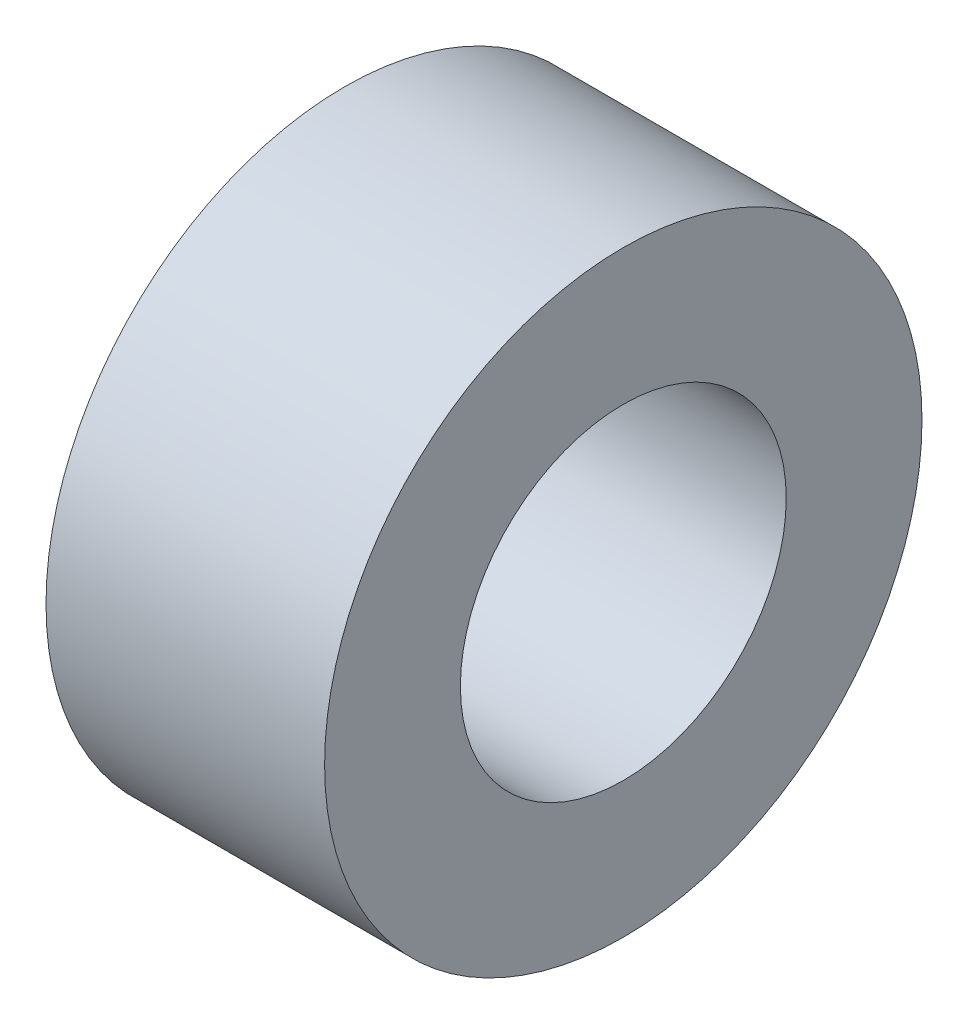
ISO-10303-21;
HEADER;
FILE_DESCRIPTION(('STEP AP214'),'2;1');
FILE_NAME('part.step','',(''),(''),'','','');
FILE_SCHEMA(('AUTOMOTIVE_DESIGN { 1 0 10303 214 1 1 1 1 }'));
ENDSEC;
DATA;
#1=APPLICATION_CONTEXT('core data for automotive mechanical design processes');
#2=APPLICATION_PROTOCOL_DEFINITION('international standard','automotive_design',2000,#1);
#3=PRODUCT_CONTEXT('',#1,'mechanical');
#4=PRODUCT('Part','Part','',(#3));
#5=PRODUCT_RELATED_PRODUCT_CATEGORY('part','',(#4));
#6=PRODUCT_DEFINITION_FORMATION('','',#4);
#7=PRODUCT_DEFINITION_CONTEXT('part definition',#1,'design');
#8=PRODUCT_DEFINITION('design','',#6,#7);
#9=PRODUCT_DEFINITION_SHAPE('','',#8);
#10=(LENGTH_UNIT() NAMED_UNIT(*) SI_UNIT(.MILLI.,.METRE.));
#11=(NAMED_UNIT(*) PLANE_ANGLE_UNIT() SI_UNIT($,.RADIAN.));
#12=(NAMED_UNIT(*) SI_UNIT($,.STERADIAN.) SOLID_ANGLE_UNIT());
#13=UNCERTAINTY_MEASURE_WITH_UNIT(LENGTH_MEASURE(1.E-05),#10,'distance_accuracy_value','');
#14=(GEOMETRIC_REPRESENTATION_CONTEXT(3) GLOBAL_UNCERTAINTY_ASSIGNED_CONTEXT((#13)) GLOBAL_UNIT_ASSIGNED_CONTEXT((#10,
#11,#12)) REPRESENTATION_CONTEXT('',''));
#15=CARTESIAN_POINT('',(0.,0.,0.));
#16=DIRECTION('',(0.,0.,1.));
#17=DIRECTION('',(1.,0.,0.));
#18=AXIS2_PLACEMENT_3D('',#15,#16,#17);
#19=CARTESIAN_POINT('',(5.13,0.,0.));
#20=DIRECTION('',(1.,0.,0.));
#21=DIRECTION('',(0.,0.,-1.));
#22=AXIS2_PLACEMENT_3D('',#19,#20,#21);
#23=PLANE('',#22);
#24=CARTESIAN_POINT('',(5.13,0.,0.));
#25=DIRECTION('',(1.,0.,0.));
#26=DIRECTION('',(0.,0.,-1.));
#27=AXIS2_PLACEMENT_3D('',#24,#25,#26);
#28=CIRCLE('',#27,5.5);
#29=CARTESIAN_POINT('',(5.13,0.,-5.5));
#30=VERTEX_POINT('',#29);
#31=EDGE_CURVE('E10',#30,#30,#28,.T.);
#32=ORIENTED_EDGE('',*,*,#31,.T.);
#33=EDGE_LOOP('',(#32));
#34=FACE_BOUND('',#33,.T.);
#35=CARTESIAN_POINT('',(5.13,0.,0.));
#36=DIRECTION('',(1.,0.,0.));
#37=DIRECTION('',(0.,0.,-1.));
#38=AXIS2_PLACEMENT_3D('',#35,#36,#37);
#39=CIRCLE('',#38,3.);
#40=CARTESIAN_POINT('',(5.13,0.,-3.));
#41=VERTEX_POINT('',#40);
#42=EDGE_CURVE('E44',#41,#41,#39,.T.);
#43=ORIENTED_EDGE('',*,*,#42,.F.);
#44=EDGE_LOOP('',(#43));
#45=FACE_BOUND('',#44,.T.);
#46=ADVANCED_FACE('F33',(#34,#45),#23,.T.);
#47=CARTESIAN_POINT('',(0.,0.,0.));
#48=DIRECTION('',(1.,0.,0.));
#49=DIRECTION('',(0.,0.,-1.));
#50=AXIS2_PLACEMENT_3D('',#47,#48,#49);
#51=PLANE('',#50);
#52=CARTESIAN_POINT('',(0.,0.,0.));
#53=DIRECTION('',(1.,0.,0.));
#54=DIRECTION('',(0.,0.,-1.));
#55=AXIS2_PLACEMENT_3D('',#52,#53,#54);
#56=CIRCLE('',#55,5.5);
#57=CARTESIAN_POINT('',(0.,0.,-5.5));
#58=VERTEX_POINT('',#57);
#59=EDGE_CURVE('E37',#58,#58,#56,.T.);
#60=ORIENTED_EDGE('',*,*,#59,.F.);
#61=EDGE_LOOP('',(#60));
#62=FACE_BOUND('',#61,.T.);
#63=CARTESIAN_POINT('',(0.,0.,0.));
#64=DIRECTION('',(1.,0.,0.));
#65=DIRECTION('',(0.,0.,-1.));
#66=AXIS2_PLACEMENT_3D('',#63,#64,#65);
#67=CIRCLE('',#66,3.);
#68=CARTESIAN_POINT('',(0.,0.,-3.));
#69=VERTEX_POINT('',#68);
#70=EDGE_CURVE('E46',#69,#69,#67,.T.);
#71=ORIENTED_EDGE('',*,*,#70,.T.);
#72=EDGE_LOOP('',(#71));
#73=FACE_BOUND('',#72,.T.);
#74=ADVANCED_FACE('F56',(#62,#73),#51,.F.);
#75=CARTESIAN_POINT('',(5.13,0.,0.));
#76=DIRECTION('',(-1.,0.,0.));
#77=DIRECTION('',(0.,0.,1.));
#78=AXIS2_PLACEMENT_3D('',#75,#76,#77);
#79=CYLINDRICAL_SURFACE('',#78,5.5);
#80=ORIENTED_EDGE('',*,*,#31,.F.);
#81=EDGE_LOOP('',(#80));
#82=FACE_BOUND('',#81,.T.);
#83=ORIENTED_EDGE('',*,*,#59,.T.);
#84=EDGE_LOOP('',(#83));
#85=FACE_BOUND('',#84,.T.);
#86=ADVANCED_FACE('F35',(#82,#85),#79,.T.);
#87=CARTESIAN_POINT('',(5.13,0.,0.));
#88=DIRECTION('',(-1.,0.,0.));
#89=DIRECTION('',(0.,0.,1.));
#90=AXIS2_PLACEMENT_3D('',#87,#88,#89);
#91=CYLINDRICAL_SURFACE('',#90,3.);
#92=ORIENTED_EDGE('',*,*,#42,.T.);
#93=EDGE_LOOP('',(#92));
#94=FACE_BOUND('',#93,.T.);
#95=ORIENTED_EDGE('',*,*,#70,.F.);
#96=EDGE_LOOP('',(#95));
#97=FACE_BOUND('',#96,.T.);
#98=ADVANCED_FACE('F52',(#94,#97),#91,.F.);
#99=CLOSED_SHELL('',(#46,#74,#86,#98));
#100=MANIFOLD_SOLID_BREP('B2',#99);
#101=ADVANCED_BREP_SHAPE_REPRESENTATION('',(#18,#100),#14);
#102=SHAPE_DEFINITION_REPRESENTATION(#9,#101);
ENDSEC;
END-ISO-10303-21;
